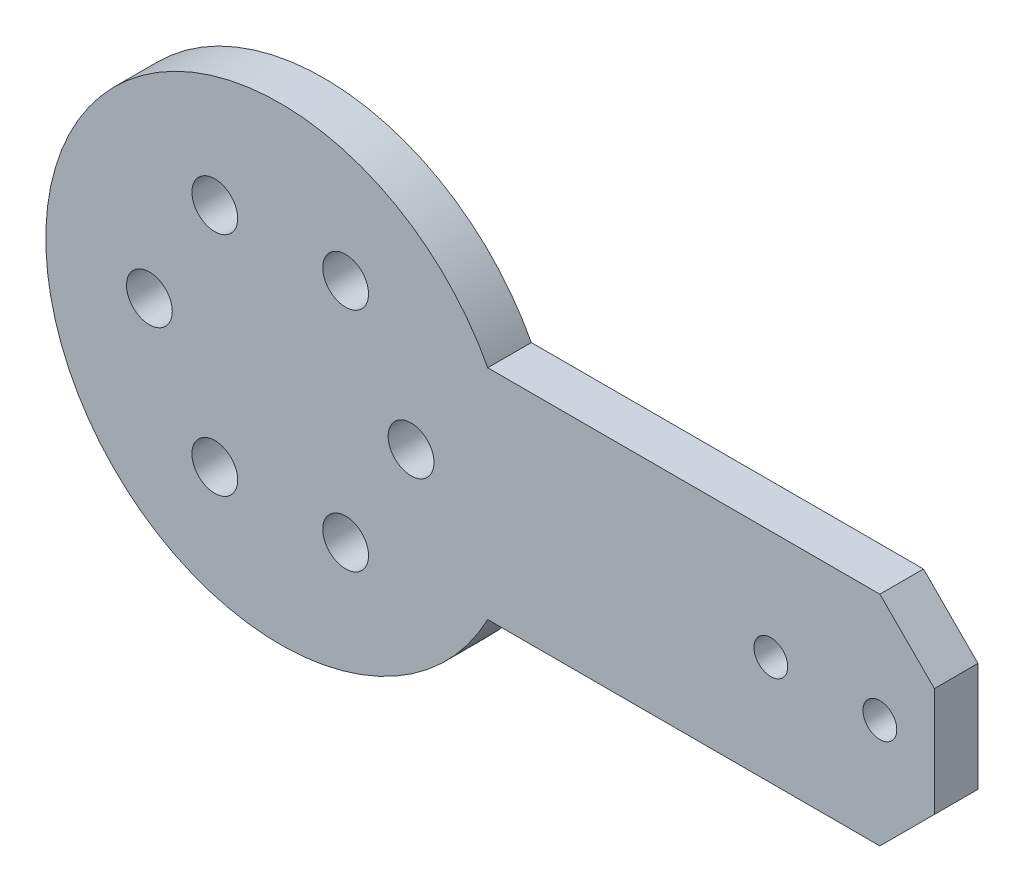
ISO-10303-21;
HEADER;
FILE_DESCRIPTION(('STEP AP214'),'2;1');
FILE_NAME('part.step','',(''),(''),'','','');
FILE_SCHEMA(('AUTOMOTIVE_DESIGN { 1 0 10303 214 1 1 1 1 }'));
ENDSEC;
DATA;
#1=APPLICATION_CONTEXT('core data for automotive mechanical design processes');
#2=APPLICATION_PROTOCOL_DEFINITION('international standard','automotive_design',2000,#1);
#3=PRODUCT_CONTEXT('',#1,'mechanical');
#4=PRODUCT('Part','Part','',(#3));
#5=PRODUCT_RELATED_PRODUCT_CATEGORY('part','',(#4));
#6=PRODUCT_DEFINITION_FORMATION('','',#4);
#7=PRODUCT_DEFINITION_CONTEXT('part definition',#1,'design');
#8=PRODUCT_DEFINITION('design','',#6,#7);
#9=PRODUCT_DEFINITION_SHAPE('','',#8);
#10=(LENGTH_UNIT() NAMED_UNIT(*) SI_UNIT(.MILLI.,.METRE.));
#11=(NAMED_UNIT(*) PLANE_ANGLE_UNIT() SI_UNIT($,.RADIAN.));
#12=(NAMED_UNIT(*) SI_UNIT($,.STERADIAN.) SOLID_ANGLE_UNIT());
#13=UNCERTAINTY_MEASURE_WITH_UNIT(LENGTH_MEASURE(1.E-05),#10,'distance_accuracy_value','');
#14=(GEOMETRIC_REPRESENTATION_CONTEXT(3) GLOBAL_UNCERTAINTY_ASSIGNED_CONTEXT((#13)) GLOBAL_UNIT_ASSIGNED_CONTEXT((#10,
#11,#12)) REPRESENTATION_CONTEXT('',''));
#15=CARTESIAN_POINT('',(0.,0.,0.));
#16=DIRECTION('',(0.,0.,1.));
#17=DIRECTION('',(1.,0.,0.));
#18=AXIS2_PLACEMENT_3D('',#15,#16,#17);
#19=CARTESIAN_POINT('',(0.,0.,4.));
#20=DIRECTION('',(0.,0.,1.));
#21=DIRECTION('',(1.,0.,0.));
#22=AXIS2_PLACEMENT_3D('',#19,#20,#21);
#23=PLANE('',#22);
#24=CARTESIAN_POINT('',(55.,0.,4.));
#25=DIRECTION('',(0.,0.,1.));
#26=DIRECTION('',(1.,0.,0.));
#27=AXIS2_PLACEMENT_3D('',#24,#25,#26);
#28=CIRCLE('',#27,1.55);
#29=CARTESIAN_POINT('',(56.55,0.,4.));
#30=VERTEX_POINT('',#29);
#31=EDGE_CURVE('E295',#30,#30,#28,.T.);
#32=ORIENTED_EDGE('',*,*,#31,.F.);
#33=EDGE_LOOP('',(#32));
#34=FACE_BOUND('',#33,.T.);
#35=CARTESIAN_POINT('',(45.,0.,4.));
#36=DIRECTION('',(0.,0.,1.));
#37=DIRECTION('',(1.,0.,0.));
#38=AXIS2_PLACEMENT_3D('',#35,#36,#37);
#39=CIRCLE('',#38,1.55);
#40=CARTESIAN_POINT('',(46.55,0.,4.));
#41=VERTEX_POINT('',#40);
#42=EDGE_CURVE('E296',#41,#41,#39,.T.);
#43=ORIENTED_EDGE('',*,*,#42,.F.);
#44=EDGE_LOOP('',(#43));
#45=FACE_BOUND('',#44,.T.);
#46=CARTESIAN_POINT('',(-5.9999999999999,10.3923048454133,4.));
#47=DIRECTION('',(0.,0.,1.));
#48=DIRECTION('',(1.,0.,0.));
#49=AXIS2_PLACEMENT_3D('',#46,#47,#48);
#50=CIRCLE('',#49,2.1);
#51=CARTESIAN_POINT('',(-3.8999999999999,10.3923048454133,4.));
#52=VERTEX_POINT('',#51);
#53=EDGE_CURVE('E312',#52,#52,#50,.T.);
#54=ORIENTED_EDGE('',*,*,#53,.F.);
#55=EDGE_LOOP('',(#54));
#56=FACE_BOUND('',#55,.T.);
#57=CARTESIAN_POINT('',(-6.00000000000005,-10.3923048454132,4.));
#58=DIRECTION('',(0.,0.,1.));
#59=DIRECTION('',(1.,0.,0.));
#60=AXIS2_PLACEMENT_3D('',#57,#58,#59);
#61=CIRCLE('',#60,2.1);
#62=CARTESIAN_POINT('',(-3.90000000000005,-10.3923048454132,4.));
#63=VERTEX_POINT('',#62);
#64=EDGE_CURVE('E324',#63,#63,#61,.T.);
#65=ORIENTED_EDGE('',*,*,#64,.F.);
#66=EDGE_LOOP('',(#65));
#67=FACE_BOUND('',#66,.T.);
#68=CARTESIAN_POINT('',(12.,0.,4.));
#69=DIRECTION('',(0.,0.,1.));
#70=DIRECTION('',(1.,0.,0.));
#71=AXIS2_PLACEMENT_3D('',#68,#69,#70);
#72=CIRCLE('',#71,2.1);
#73=CARTESIAN_POINT('',(14.1,0.,4.));
#74=VERTEX_POINT('',#73);
#75=EDGE_CURVE('E150',#74,#74,#72,.T.);
#76=ORIENTED_EDGE('',*,*,#75,.F.);
#77=EDGE_LOOP('',(#76));
#78=FACE_BOUND('',#77,.T.);
#79=DIRECTION('',(1.,0.,0.));
#80=VECTOR('',#79,1.);
#81=CARTESIAN_POINT('',(60.,-10.,4.));
#82=LINE('',#81,#80);
#83=CARTESIAN_POINT('',(19.0328663106743,-10.,4.));
#84=VERTEX_POINT('',#83);
#85=CARTESIAN_POINT('',(55.,-10.,4.));
#86=VERTEX_POINT('',#85);
#87=EDGE_CURVE('E97',#84,#86,#82,.T.);
#88=ORIENTED_EDGE('',*,*,#87,.T.);
#89=DIRECTION('',(-0.707106781186549,-0.707106781186547,0.));
#90=VECTOR('',#89,1.);
#91=CARTESIAN_POINT('',(32.4999999999999,-32.5,4.));
#92=LINE('',#91,#90);
#93=CARTESIAN_POINT('',(60.,-5.00000000000001,4.));
#94=VERTEX_POINT('',#93);
#95=EDGE_CURVE('E52',#86,#94,#92,.F.);
#96=ORIENTED_EDGE('',*,*,#95,.T.);
#97=DIRECTION('',(0.,1.,0.));
#98=VECTOR('',#97,1.);
#99=CARTESIAN_POINT('',(60.,-10.,4.));
#100=LINE('',#99,#98);
#101=CARTESIAN_POINT('',(60.,4.99999999999997,4.));
#102=VERTEX_POINT('',#101);
#103=EDGE_CURVE('E104',#94,#102,#100,.T.);
#104=ORIENTED_EDGE('',*,*,#103,.T.);
#105=DIRECTION('',(0.707106781186545,-0.70710678118655,0.));
#106=VECTOR('',#105,1.);
#107=CARTESIAN_POINT('',(32.5000000000002,32.5,4.));
#108=LINE('',#107,#106);
#109=CARTESIAN_POINT('',(55.,10.,4.));
#110=VERTEX_POINT('',#109);
#111=EDGE_CURVE('E59',#102,#110,#108,.F.);
#112=ORIENTED_EDGE('',*,*,#111,.T.);
#113=DIRECTION('',(-1.,0.,0.));
#114=VECTOR('',#113,1.);
#115=CARTESIAN_POINT('',(19.0328663106743,10.,4.));
#116=LINE('',#115,#114);
#117=CARTESIAN_POINT('',(19.0328663106743,10.,4.));
#118=VERTEX_POINT('',#117);
#119=EDGE_CURVE('E109',#110,#118,#116,.T.);
#120=ORIENTED_EDGE('',*,*,#119,.T.);
#121=CARTESIAN_POINT('',(0.,0.,4.));
#122=DIRECTION('',(0.,0.,1.));
#123=DIRECTION('',(1.,0.,0.));
#124=AXIS2_PLACEMENT_3D('',#121,#122,#123);
#125=CIRCLE('',#124,21.5);
#126=EDGE_CURVE('E105',#118,#84,#125,.T.);
#127=ORIENTED_EDGE('',*,*,#126,.T.);
#128=EDGE_LOOP('',(#88,#96,#104,#112,#120,#127));
#129=FACE_BOUND('',#128,.T.);
#130=CARTESIAN_POINT('',(5.99999999999998,-10.3923048454133,4.));
#131=DIRECTION('',(0.,0.,1.));
#132=DIRECTION('',(1.,0.,0.));
#133=AXIS2_PLACEMENT_3D('',#130,#131,#132);
#134=CIRCLE('',#133,2.1);
#135=CARTESIAN_POINT('',(8.09999999999998,-10.3923048454133,4.));
#136=VERTEX_POINT('',#135);
#137=EDGE_CURVE('E330',#136,#136,#134,.T.);
#138=ORIENTED_EDGE('',*,*,#137,.F.);
#139=EDGE_LOOP('',(#138));
#140=FACE_BOUND('',#139,.T.);
#141=CARTESIAN_POINT('',(-12.,0.,4.));
#142=DIRECTION('',(0.,0.,1.));
#143=DIRECTION('',(1.,0.,0.));
#144=AXIS2_PLACEMENT_3D('',#141,#142,#143);
#145=CIRCLE('',#144,2.1);
#146=CARTESIAN_POINT('',(-9.9,0.,4.));
#147=VERTEX_POINT('',#146);
#148=EDGE_CURVE('E318',#147,#147,#145,.T.);
#149=ORIENTED_EDGE('',*,*,#148,.F.);
#150=EDGE_LOOP('',(#149));
#151=FACE_BOUND('',#150,.T.);
#152=CARTESIAN_POINT('',(6.00000000000012,10.3923048454132,4.));
#153=DIRECTION('',(0.,0.,1.));
#154=DIRECTION('',(1.,0.,0.));
#155=AXIS2_PLACEMENT_3D('',#152,#153,#154);
#156=CIRCLE('',#155,2.1);
#157=CARTESIAN_POINT('',(8.10000000000012,10.3923048454132,4.));
#158=VERTEX_POINT('',#157);
#159=EDGE_CURVE('E306',#158,#158,#156,.T.);
#160=ORIENTED_EDGE('',*,*,#159,.F.);
#161=EDGE_LOOP('',(#160));
#162=FACE_BOUND('',#161,.T.);
#163=ADVANCED_FACE('F43',(#34,#45,#56,#67,#78,#129,#140,#151,#162),#23,.T.);
#164=CARTESIAN_POINT('',(0.,0.,0.));
#165=DIRECTION('',(0.,0.,1.));
#166=DIRECTION('',(1.,0.,0.));
#167=AXIS2_PLACEMENT_3D('',#164,#165,#166);
#168=PLANE('',#167);
#169=CARTESIAN_POINT('',(55.,0.,0.));
#170=DIRECTION('',(0.,0.,1.));
#171=DIRECTION('',(1.,0.,0.));
#172=AXIS2_PLACEMENT_3D('',#169,#170,#171);
#173=CIRCLE('',#172,1.55);
#174=CARTESIAN_POINT('',(56.55,0.,0.));
#175=VERTEX_POINT('',#174);
#176=EDGE_CURVE('E293',#175,#175,#173,.T.);
#177=ORIENTED_EDGE('',*,*,#176,.T.);
#178=EDGE_LOOP('',(#177));
#179=FACE_BOUND('',#178,.T.);
#180=CARTESIAN_POINT('',(45.,0.,0.));
#181=DIRECTION('',(0.,0.,1.));
#182=DIRECTION('',(1.,0.,0.));
#183=AXIS2_PLACEMENT_3D('',#180,#181,#182);
#184=CIRCLE('',#183,1.55);
#185=CARTESIAN_POINT('',(46.55,0.,0.));
#186=VERTEX_POINT('',#185);
#187=EDGE_CURVE('E301',#186,#186,#184,.T.);
#188=ORIENTED_EDGE('',*,*,#187,.T.);
#189=EDGE_LOOP('',(#188));
#190=FACE_BOUND('',#189,.T.);
#191=DIRECTION('',(0.,1.,0.));
#192=VECTOR('',#191,1.);
#193=CARTESIAN_POINT('',(60.,-10.,0.));
#194=LINE('',#193,#192);
#195=CARTESIAN_POINT('',(60.,-5.00000000000001,0.));
#196=VERTEX_POINT('',#195);
#197=CARTESIAN_POINT('',(60.,4.99999999999997,0.));
#198=VERTEX_POINT('',#197);
#199=EDGE_CURVE('E147',#196,#198,#194,.T.);
#200=ORIENTED_EDGE('',*,*,#199,.F.);
#201=DIRECTION('',(0.707106781186549,0.707106781186547,0.));
#202=VECTOR('',#201,1.);
#203=CARTESIAN_POINT('',(60.,-5.00000000000001,0.));
#204=LINE('',#203,#202);
#205=CARTESIAN_POINT('',(55.,-10.,0.));
#206=VERTEX_POINT('',#205);
#207=EDGE_CURVE('E130',#196,#206,#204,.F.);
#208=ORIENTED_EDGE('',*,*,#207,.T.);
#209=DIRECTION('',(1.,0.,0.));
#210=VECTOR('',#209,1.);
#211=CARTESIAN_POINT('',(60.,-10.,0.));
#212=LINE('',#211,#210);
#213=CARTESIAN_POINT('',(19.0328663106743,-10.,0.));
#214=VERTEX_POINT('',#213);
#215=EDGE_CURVE('E146',#214,#206,#212,.T.);
#216=ORIENTED_EDGE('',*,*,#215,.F.);
#217=CARTESIAN_POINT('',(0.,0.,0.));
#218=DIRECTION('',(0.,0.,1.));
#219=DIRECTION('',(1.,0.,0.));
#220=AXIS2_PLACEMENT_3D('',#217,#218,#219);
#221=CIRCLE('',#220,21.5);
#222=CARTESIAN_POINT('',(19.0328663106743,10.,0.));
#223=VERTEX_POINT('',#222);
#224=EDGE_CURVE('E117',#223,#214,#221,.T.);
#225=ORIENTED_EDGE('',*,*,#224,.F.);
#226=DIRECTION('',(-1.,0.,0.));
#227=VECTOR('',#226,1.);
#228=CARTESIAN_POINT('',(19.0328663106743,10.,0.));
#229=LINE('',#228,#227);
#230=CARTESIAN_POINT('',(55.,10.,0.));
#231=VERTEX_POINT('',#230);
#232=EDGE_CURVE('E113',#231,#223,#229,.T.);
#233=ORIENTED_EDGE('',*,*,#232,.F.);
#234=DIRECTION('',(-0.707106781186545,0.70710678118655,0.));
#235=VECTOR('',#234,1.);
#236=CARTESIAN_POINT('',(55.,10.,0.));
#237=LINE('',#236,#235);
#238=EDGE_CURVE('E128',#231,#198,#237,.F.);
#239=ORIENTED_EDGE('',*,*,#238,.T.);
#240=EDGE_LOOP('',(#200,#208,#216,#225,#233,#239));
#241=FACE_BOUND('',#240,.T.);
#242=CARTESIAN_POINT('',(12.,0.,0.));
#243=DIRECTION('',(0.,0.,1.));
#244=DIRECTION('',(1.,0.,0.));
#245=AXIS2_PLACEMENT_3D('',#242,#243,#244);
#246=CIRCLE('',#245,2.1);
#247=CARTESIAN_POINT('',(14.1,0.,0.));
#248=VERTEX_POINT('',#247);
#249=EDGE_CURVE('E333',#248,#248,#246,.T.);
#250=ORIENTED_EDGE('',*,*,#249,.T.);
#251=EDGE_LOOP('',(#250));
#252=FACE_BOUND('',#251,.T.);
#253=CARTESIAN_POINT('',(5.99999999999998,-10.3923048454133,0.));
#254=DIRECTION('',(0.,0.,1.));
#255=DIRECTION('',(1.,0.,0.));
#256=AXIS2_PLACEMENT_3D('',#253,#254,#255);
#257=CIRCLE('',#256,2.1);
#258=CARTESIAN_POINT('',(8.09999999999998,-10.3923048454133,0.));
#259=VERTEX_POINT('',#258);
#260=EDGE_CURVE('E327',#259,#259,#257,.T.);
#261=ORIENTED_EDGE('',*,*,#260,.T.);
#262=EDGE_LOOP('',(#261));
#263=FACE_BOUND('',#262,.T.);
#264=CARTESIAN_POINT('',(-6.00000000000005,-10.3923048454132,0.));
#265=DIRECTION('',(0.,0.,1.));
#266=DIRECTION('',(1.,0.,0.));
#267=AXIS2_PLACEMENT_3D('',#264,#265,#266);
#268=CIRCLE('',#267,2.1);
#269=CARTESIAN_POINT('',(-3.90000000000005,-10.3923048454132,0.));
#270=VERTEX_POINT('',#269);
#271=EDGE_CURVE('E321',#270,#270,#268,.T.);
#272=ORIENTED_EDGE('',*,*,#271,.T.);
#273=EDGE_LOOP('',(#272));
#274=FACE_BOUND('',#273,.T.);
#275=CARTESIAN_POINT('',(-12.,0.,0.));
#276=DIRECTION('',(0.,0.,1.));
#277=DIRECTION('',(1.,0.,0.));
#278=AXIS2_PLACEMENT_3D('',#275,#276,#277);
#279=CIRCLE('',#278,2.1);
#280=CARTESIAN_POINT('',(-9.9,0.,0.));
#281=VERTEX_POINT('',#280);
#282=EDGE_CURVE('E315',#281,#281,#279,.T.);
#283=ORIENTED_EDGE('',*,*,#282,.T.);
#284=EDGE_LOOP('',(#283));
#285=FACE_BOUND('',#284,.T.);
#286=CARTESIAN_POINT('',(-5.9999999999999,10.3923048454133,0.));
#287=DIRECTION('',(0.,0.,1.));
#288=DIRECTION('',(1.,0.,0.));
#289=AXIS2_PLACEMENT_3D('',#286,#287,#288);
#290=CIRCLE('',#289,2.1);
#291=CARTESIAN_POINT('',(-3.8999999999999,10.3923048454133,0.));
#292=VERTEX_POINT('',#291);
#293=EDGE_CURVE('E309',#292,#292,#290,.T.);
#294=ORIENTED_EDGE('',*,*,#293,.T.);
#295=EDGE_LOOP('',(#294));
#296=FACE_BOUND('',#295,.T.);
#297=CARTESIAN_POINT('',(6.00000000000012,10.3923048454132,0.));
#298=DIRECTION('',(0.,0.,1.));
#299=DIRECTION('',(1.,0.,0.));
#300=AXIS2_PLACEMENT_3D('',#297,#298,#299);
#301=CIRCLE('',#300,2.1);
#302=CARTESIAN_POINT('',(8.10000000000012,10.3923048454132,0.));
#303=VERTEX_POINT('',#302);
#304=EDGE_CURVE('E298',#303,#303,#301,.T.);
#305=ORIENTED_EDGE('',*,*,#304,.T.);
#306=EDGE_LOOP('',(#305));
#307=FACE_BOUND('',#306,.T.);
#308=ADVANCED_FACE('F144',(#179,#190,#241,#252,#263,#274,#285,#296,#307),#168,.F.);
#309=CARTESIAN_POINT('',(0.,0.,4.));
#310=DIRECTION('',(0.,0.,-1.));
#311=DIRECTION('',(-1.,0.,0.));
#312=AXIS2_PLACEMENT_3D('',#309,#310,#311);
#313=CYLINDRICAL_SURFACE('',#312,21.5);
#314=ORIENTED_EDGE('',*,*,#224,.T.);
#315=DIRECTION('',(0.,0.,-1.));
#316=VECTOR('',#315,1.);
#317=CARTESIAN_POINT('',(19.0328663106743,-10.,4.));
#318=LINE('',#317,#316);
#319=EDGE_CURVE('E101',#84,#214,#318,.T.);
#320=ORIENTED_EDGE('',*,*,#319,.F.);
#321=ORIENTED_EDGE('',*,*,#126,.F.);
#322=DIRECTION('',(0.,0.,-1.));
#323=VECTOR('',#322,1.);
#324=CARTESIAN_POINT('',(19.0328663106743,10.,4.));
#325=LINE('',#324,#323);
#326=EDGE_CURVE('E119',#118,#223,#325,.T.);
#327=ORIENTED_EDGE('',*,*,#326,.T.);
#328=EDGE_LOOP('',(#314,#320,#321,#327));
#329=FACE_BOUND('',#328,.T.);
#330=ADVANCED_FACE('F115',(#329),#313,.T.);
#331=CARTESIAN_POINT('',(60.,-10.,4.));
#332=DIRECTION('',(0.,1.,0.));
#333=DIRECTION('',(-1.,0.,0.));
#334=AXIS2_PLACEMENT_3D('',#331,#332,#333);
#335=PLANE('',#334);
#336=ORIENTED_EDGE('',*,*,#215,.T.);
#337=DIRECTION('',(0.,0.,1.));
#338=VECTOR('',#337,1.);
#339=CARTESIAN_POINT('',(55.,-10.,4.));
#340=LINE('',#339,#338);
#341=EDGE_CURVE('E67',#206,#86,#340,.T.);
#342=ORIENTED_EDGE('',*,*,#341,.T.);
#343=ORIENTED_EDGE('',*,*,#87,.F.);
#344=ORIENTED_EDGE('',*,*,#319,.T.);
#345=EDGE_LOOP('',(#336,#342,#343,#344));
#346=FACE_BOUND('',#345,.T.);
#347=ADVANCED_FACE('F99',(#346),#335,.F.);
#348=CARTESIAN_POINT('',(60.,-10.,4.));
#349=DIRECTION('',(-1.,0.,0.));
#350=DIRECTION('',(0.,0.,1.));
#351=AXIS2_PLACEMENT_3D('',#348,#349,#350);
#352=PLANE('',#351);
#353=ORIENTED_EDGE('',*,*,#103,.F.);
#354=DIRECTION('',(0.,0.,-1.));
#355=VECTOR('',#354,1.);
#356=CARTESIAN_POINT('',(60.,-5.00000000000001,4.));
#357=LINE('',#356,#355);
#358=EDGE_CURVE('E121',#94,#196,#357,.T.);
#359=ORIENTED_EDGE('',*,*,#358,.T.);
#360=ORIENTED_EDGE('',*,*,#199,.T.);
#361=DIRECTION('',(0.,0.,1.));
#362=VECTOR('',#361,1.);
#363=CARTESIAN_POINT('',(60.,4.99999999999997,4.));
#364=LINE('',#363,#362);
#365=EDGE_CURVE('E118',#198,#102,#364,.T.);
#366=ORIENTED_EDGE('',*,*,#365,.T.);
#367=EDGE_LOOP('',(#353,#359,#360,#366));
#368=FACE_BOUND('',#367,.T.);
#369=ADVANCED_FACE('F137',(#368),#352,.F.);
#370=CARTESIAN_POINT('',(19.0328663106743,10.,4.));
#371=DIRECTION('',(0.,-1.,0.));
#372=DIRECTION('',(0.,0.,-1.));
#373=AXIS2_PLACEMENT_3D('',#370,#371,#372);
#374=PLANE('',#373);
#375=ORIENTED_EDGE('',*,*,#119,.F.);
#376=DIRECTION('',(0.,0.,-1.));
#377=VECTOR('',#376,1.);
#378=CARTESIAN_POINT('',(55.,10.,4.));
#379=LINE('',#378,#377);
#380=EDGE_CURVE('E11',#110,#231,#379,.T.);
#381=ORIENTED_EDGE('',*,*,#380,.T.);
#382=ORIENTED_EDGE('',*,*,#232,.T.);
#383=ORIENTED_EDGE('',*,*,#326,.F.);
#384=EDGE_LOOP('',(#375,#381,#382,#383));
#385=FACE_BOUND('',#384,.T.);
#386=ADVANCED_FACE('F155',(#385),#374,.F.);
#387=CARTESIAN_POINT('',(12.,0.,4.));
#388=DIRECTION('',(0.,0.,-1.));
#389=DIRECTION('',(-1.,0.,0.));
#390=AXIS2_PLACEMENT_3D('',#387,#388,#389);
#391=CYLINDRICAL_SURFACE('',#390,2.1);
#392=ORIENTED_EDGE('',*,*,#75,.T.);
#393=EDGE_LOOP('',(#392));
#394=FACE_BOUND('',#393,.T.);
#395=ORIENTED_EDGE('',*,*,#249,.F.);
#396=EDGE_LOOP('',(#395));
#397=FACE_BOUND('',#396,.T.);
#398=ADVANCED_FACE('F179',(#394,#397),#391,.F.);
#399=CARTESIAN_POINT('',(5.99999999999998,-10.3923048454133,4.));
#400=DIRECTION('',(0.,0.,-1.));
#401=DIRECTION('',(-1.,0.,0.));
#402=AXIS2_PLACEMENT_3D('',#399,#400,#401);
#403=CYLINDRICAL_SURFACE('',#402,2.1);
#404=ORIENTED_EDGE('',*,*,#137,.T.);
#405=EDGE_LOOP('',(#404));
#406=FACE_BOUND('',#405,.T.);
#407=ORIENTED_EDGE('',*,*,#260,.F.);
#408=EDGE_LOOP('',(#407));
#409=FACE_BOUND('',#408,.T.);
#410=ADVANCED_FACE('F205',(#406,#409),#403,.F.);
#411=CARTESIAN_POINT('',(-6.00000000000005,-10.3923048454132,4.));
#412=DIRECTION('',(0.,0.,-1.));
#413=DIRECTION('',(-1.,0.,0.));
#414=AXIS2_PLACEMENT_3D('',#411,#412,#413);
#415=CYLINDRICAL_SURFACE('',#414,2.1);
#416=ORIENTED_EDGE('',*,*,#64,.T.);
#417=EDGE_LOOP('',(#416));
#418=FACE_BOUND('',#417,.T.);
#419=ORIENTED_EDGE('',*,*,#271,.F.);
#420=EDGE_LOOP('',(#419));
#421=FACE_BOUND('',#420,.T.);
#422=ADVANCED_FACE('F214',(#418,#421),#415,.F.);
#423=CARTESIAN_POINT('',(-12.,0.,4.));
#424=DIRECTION('',(0.,0.,-1.));
#425=DIRECTION('',(-1.,0.,0.));
#426=AXIS2_PLACEMENT_3D('',#423,#424,#425);
#427=CYLINDRICAL_SURFACE('',#426,2.1);
#428=ORIENTED_EDGE('',*,*,#148,.T.);
#429=EDGE_LOOP('',(#428));
#430=FACE_BOUND('',#429,.T.);
#431=ORIENTED_EDGE('',*,*,#282,.F.);
#432=EDGE_LOOP('',(#431));
#433=FACE_BOUND('',#432,.T.);
#434=ADVANCED_FACE('F222',(#430,#433),#427,.F.);
#435=CARTESIAN_POINT('',(-5.9999999999999,10.3923048454133,4.));
#436=DIRECTION('',(0.,0.,-1.));
#437=DIRECTION('',(-1.,0.,0.));
#438=AXIS2_PLACEMENT_3D('',#435,#436,#437);
#439=CYLINDRICAL_SURFACE('',#438,2.1);
#440=ORIENTED_EDGE('',*,*,#53,.T.);
#441=EDGE_LOOP('',(#440));
#442=FACE_BOUND('',#441,.T.);
#443=ORIENTED_EDGE('',*,*,#293,.F.);
#444=EDGE_LOOP('',(#443));
#445=FACE_BOUND('',#444,.T.);
#446=ADVANCED_FACE('F231',(#442,#445),#439,.F.);
#447=CARTESIAN_POINT('',(6.00000000000012,10.3923048454132,4.));
#448=DIRECTION('',(0.,0.,-1.));
#449=DIRECTION('',(-1.,0.,0.));
#450=AXIS2_PLACEMENT_3D('',#447,#448,#449);
#451=CYLINDRICAL_SURFACE('',#450,2.1);
#452=ORIENTED_EDGE('',*,*,#159,.T.);
#453=EDGE_LOOP('',(#452));
#454=FACE_BOUND('',#453,.T.);
#455=ORIENTED_EDGE('',*,*,#304,.F.);
#456=EDGE_LOOP('',(#455));
#457=FACE_BOUND('',#456,.T.);
#458=ADVANCED_FACE('F168',(#454,#457),#451,.F.);
#459=CARTESIAN_POINT('',(60.,-5.00000000000001,4.));
#460=DIRECTION('',(-0.707106781186547,0.707106781186549,0.));
#461=DIRECTION('',(0.,0.,-1.));
#462=AXIS2_PLACEMENT_3D('',#459,#460,#461);
#463=PLANE('',#462);
#464=ORIENTED_EDGE('',*,*,#95,.F.);
#465=ORIENTED_EDGE('',*,*,#341,.F.);
#466=ORIENTED_EDGE('',*,*,#207,.F.);
#467=ORIENTED_EDGE('',*,*,#358,.F.);
#468=EDGE_LOOP('',(#464,#465,#466,#467));
#469=FACE_BOUND('',#468,.T.);
#470=ADVANCED_FACE('F142',(#469),#463,.F.);
#471=CARTESIAN_POINT('',(55.,10.,4.));
#472=DIRECTION('',(-0.707106781186551,-0.707106781186545,0.));
#473=DIRECTION('',(0.,0.,-1.));
#474=AXIS2_PLACEMENT_3D('',#471,#472,#473);
#475=PLANE('',#474);
#476=ORIENTED_EDGE('',*,*,#111,.F.);
#477=ORIENTED_EDGE('',*,*,#365,.F.);
#478=ORIENTED_EDGE('',*,*,#238,.F.);
#479=ORIENTED_EDGE('',*,*,#380,.F.);
#480=EDGE_LOOP('',(#476,#477,#478,#479));
#481=FACE_BOUND('',#480,.T.);
#482=ADVANCED_FACE('F46',(#481),#475,.F.);
#483=CARTESIAN_POINT('',(45.,0.,0.));
#484=DIRECTION('',(0.,0.,1.));
#485=DIRECTION('',(1.,0.,0.));
#486=AXIS2_PLACEMENT_3D('',#483,#484,#485);
#487=CYLINDRICAL_SURFACE('',#486,1.55);
#488=ORIENTED_EDGE('',*,*,#187,.F.);
#489=EDGE_LOOP('',(#488));
#490=FACE_BOUND('',#489,.T.);
#491=ORIENTED_EDGE('',*,*,#42,.T.);
#492=EDGE_LOOP('',(#491));
#493=FACE_BOUND('',#492,.T.);
#494=ADVANCED_FACE('F159',(#490,#493),#487,.F.);
#495=CARTESIAN_POINT('',(55.,0.,0.));
#496=DIRECTION('',(0.,0.,1.));
#497=DIRECTION('',(1.,0.,0.));
#498=AXIS2_PLACEMENT_3D('',#495,#496,#497);
#499=CYLINDRICAL_SURFACE('',#498,1.55);
#500=ORIENTED_EDGE('',*,*,#176,.F.);
#501=EDGE_LOOP('',(#500));
#502=FACE_BOUND('',#501,.T.);
#503=ORIENTED_EDGE('',*,*,#31,.T.);
#504=EDGE_LOOP('',(#503));
#505=FACE_BOUND('',#504,.T.);
#506=ADVANCED_FACE('F165',(#502,#505),#499,.F.);
#507=CLOSED_SHELL('',(#163,#308,#330,#347,#369,#386,#398,#410,#422,#434,#446,#458,#470,#482,
#494,#506));
#508=MANIFOLD_SOLID_BREP('B2',#507);
#509=ADVANCED_BREP_SHAPE_REPRESENTATION('',(#18,#508),#14);
#510=SHAPE_DEFINITION_REPRESENTATION(#9,#509);
ENDSEC;
END-ISO-10303-21;
